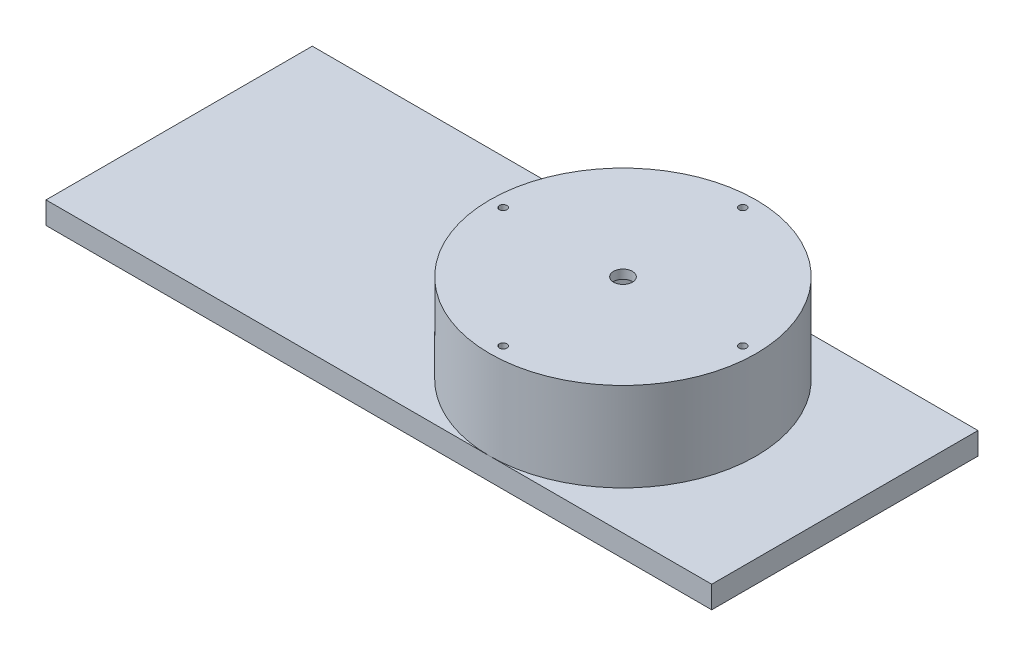
ISO-10303-21;
HEADER;
FILE_DESCRIPTION(('STEP AP214'),'2;1');
FILE_NAME('part.step','',(''),(''),'','','');
FILE_SCHEMA(('AUTOMOTIVE_DESIGN { 1 0 10303 214 1 1 1 1 }'));
ENDSEC;
DATA;
#1=APPLICATION_CONTEXT('core data for automotive mechanical design processes');
#2=APPLICATION_PROTOCOL_DEFINITION('international standard','automotive_design',2000,#1);
#3=PRODUCT_CONTEXT('',#1,'mechanical');
#4=PRODUCT('Part','Part','',(#3));
#5=PRODUCT_RELATED_PRODUCT_CATEGORY('part','',(#4));
#6=PRODUCT_DEFINITION_FORMATION('','',#4);
#7=PRODUCT_DEFINITION_CONTEXT('part definition',#1,'design');
#8=PRODUCT_DEFINITION('design','',#6,#7);
#9=PRODUCT_DEFINITION_SHAPE('','',#8);
#10=(LENGTH_UNIT() NAMED_UNIT(*) SI_UNIT(.MILLI.,.METRE.));
#11=(NAMED_UNIT(*) PLANE_ANGLE_UNIT() SI_UNIT($,.RADIAN.));
#12=(NAMED_UNIT(*) SI_UNIT($,.STERADIAN.) SOLID_ANGLE_UNIT());
#13=UNCERTAINTY_MEASURE_WITH_UNIT(LENGTH_MEASURE(1.E-05),#10,'distance_accuracy_value','');
#14=(GEOMETRIC_REPRESENTATION_CONTEXT(3) GLOBAL_UNCERTAINTY_ASSIGNED_CONTEXT((#13)) GLOBAL_UNIT_ASSIGNED_CONTEXT((#10,
#11,#12)) REPRESENTATION_CONTEXT('',''));
#15=CARTESIAN_POINT('',(0.,0.,0.));
#16=DIRECTION('',(0.,0.,1.));
#17=DIRECTION('',(1.,0.,0.));
#18=AXIS2_PLACEMENT_3D('',#15,#16,#17);
#19=CARTESIAN_POINT('',(-100.,50.,-60.));
#20=DIRECTION('',(0.,-1.,0.));
#21=DIRECTION('',(0.,0.,-1.));
#22=AXIS2_PLACEMENT_3D('',#19,#20,#21);
#23=CYLINDRICAL_SURFACE('',#22,60.);
#24=CARTESIAN_POINT('',(-100.,50.,-60.));
#25=DIRECTION('',(0.,1.,0.));
#26=DIRECTION('',(0.,0.,1.));
#27=AXIS2_PLACEMENT_3D('',#24,#25,#26);
#28=CIRCLE('',#27,60.);
#29=CARTESIAN_POINT('',(-100.,50.,0.));
#30=VERTEX_POINT('',#29);
#31=EDGE_CURVE('E176',#30,#30,#28,.T.);
#32=ORIENTED_EDGE('',*,*,#31,.F.);
#33=EDGE_LOOP('',(#32));
#34=FACE_BOUND('',#33,.T.);
#35=CARTESIAN_POINT('',(-100.,12.,-60.));
#36=DIRECTION('',(0.,-1.,0.));
#37=DIRECTION('',(0.,0.,-1.));
#38=AXIS2_PLACEMENT_3D('',#35,#36,#37);
#39=CIRCLE('',#38,60.);
#40=CARTESIAN_POINT('',(-159.160797830996,12.,-50.));
#41=VERTEX_POINT('',#40);
#42=CARTESIAN_POINT('',(-159.160797830996,12.,-70.));
#43=VERTEX_POINT('',#42);
#44=EDGE_CURVE('E159',#41,#43,#39,.T.);
#45=ORIENTED_EDGE('',*,*,#44,.F.);
#46=DIRECTION('',(0.,-1.,0.));
#47=VECTOR('',#46,1.);
#48=CARTESIAN_POINT('',(-159.160797830996,50.,-50.));
#49=LINE('',#48,#47);
#50=CARTESIAN_POINT('',(-159.160797830996,10.,-50.));
#51=VERTEX_POINT('',#50);
#52=EDGE_CURVE('E156',#41,#51,#49,.T.);
#53=ORIENTED_EDGE('',*,*,#52,.T.);
#54=CARTESIAN_POINT('',(-100.,10.,-60.));
#55=DIRECTION('',(0.,1.,0.));
#56=DIRECTION('',(0.,0.,1.));
#57=AXIS2_PLACEMENT_3D('',#54,#55,#56);
#58=CIRCLE('',#57,60.);
#59=CARTESIAN_POINT('',(-100.,10.,0.));
#60=VERTEX_POINT('',#59);
#61=EDGE_CURVE('E182',#51,#60,#58,.T.);
#62=ORIENTED_EDGE('',*,*,#61,.T.);
#63=CARTESIAN_POINT('',(-100.,10.,-120.));
#64=VERTEX_POINT('',#63);
#65=EDGE_CURVE('E173',#60,#64,#58,.T.);
#66=ORIENTED_EDGE('',*,*,#65,.T.);
#67=CARTESIAN_POINT('',(-159.160797830996,10.,-70.));
#68=VERTEX_POINT('',#67);
#69=EDGE_CURVE('E183',#64,#68,#58,.T.);
#70=ORIENTED_EDGE('',*,*,#69,.T.);
#71=DIRECTION('',(0.,-1.,0.));
#72=VECTOR('',#71,1.);
#73=CARTESIAN_POINT('',(-159.160797830996,50.,-70.));
#74=LINE('',#73,#72);
#75=EDGE_CURVE('E161',#43,#68,#74,.T.);
#76=ORIENTED_EDGE('',*,*,#75,.F.);
#77=EDGE_LOOP('',(#45,#53,#62,#66,#70,#76));
#78=FACE_BOUND('',#77,.T.);
#79=ADVANCED_FACE('F36',(#34,#78),#23,.T.);
#80=CARTESIAN_POINT('',(-100.,46.,-60.));
#81=DIRECTION('',(0.,-1.,0.));
#82=DIRECTION('',(0.,0.,-1.));
#83=AXIS2_PLACEMENT_3D('',#80,#81,#82);
#84=CYLINDRICAL_SURFACE('',#83,48.);
#85=CARTESIAN_POINT('',(-100.,0.,-60.));
#86=DIRECTION('',(0.,-1.,0.));
#87=DIRECTION('',(0.,0.,-1.));
#88=AXIS2_PLACEMENT_3D('',#85,#86,#87);
#89=CIRCLE('',#88,48.);
#90=CARTESIAN_POINT('',(-100.,0.,-108.));
#91=VERTEX_POINT('',#90);
#92=EDGE_CURVE('E169',#91,#91,#89,.T.);
#93=ORIENTED_EDGE('',*,*,#92,.T.);
#94=EDGE_LOOP('',(#93));
#95=FACE_BOUND('',#94,.T.);
#96=CARTESIAN_POINT('',(-100.,46.,-60.));
#97=DIRECTION('',(0.,-1.,0.));
#98=DIRECTION('',(0.,0.,-1.));
#99=AXIS2_PLACEMENT_3D('',#96,#97,#98);
#100=CIRCLE('',#99,48.);
#101=CARTESIAN_POINT('',(-100.,46.,-108.));
#102=VERTEX_POINT('',#101);
#103=EDGE_CURVE('E170',#102,#102,#100,.T.);
#104=ORIENTED_EDGE('',*,*,#103,.F.);
#105=EDGE_LOOP('',(#104));
#106=FACE_BOUND('',#105,.T.);
#107=DIRECTION('',(0.,-1.,0.));
#108=VECTOR('',#107,1.);
#109=CARTESIAN_POINT('',(-146.946778377222,46.,-70.));
#110=LINE('',#109,#108);
#111=CARTESIAN_POINT('',(-146.946778377222,10.,-70.));
#112=VERTEX_POINT('',#111);
#113=CARTESIAN_POINT('',(-146.946778377222,12.,-70.));
#114=VERTEX_POINT('',#113);
#115=EDGE_CURVE('E11',#112,#114,#110,.F.);
#116=ORIENTED_EDGE('',*,*,#115,.F.);
#117=CARTESIAN_POINT('',(-100.,10.,-60.));
#118=DIRECTION('',(0.,-1.,0.));
#119=DIRECTION('',(0.,0.,-1.));
#120=AXIS2_PLACEMENT_3D('',#117,#118,#119);
#121=CIRCLE('',#120,48.);
#122=CARTESIAN_POINT('',(-146.946778377222,10.,-50.));
#123=VERTEX_POINT('',#122);
#124=EDGE_CURVE('E217',#112,#123,#121,.F.);
#125=ORIENTED_EDGE('',*,*,#124,.T.);
#126=DIRECTION('',(0.,-1.,0.));
#127=VECTOR('',#126,1.);
#128=CARTESIAN_POINT('',(-146.946778377222,46.,-50.));
#129=LINE('',#128,#127);
#130=CARTESIAN_POINT('',(-146.946778377222,12.,-50.));
#131=VERTEX_POINT('',#130);
#132=EDGE_CURVE('E220',#123,#131,#129,.F.);
#133=ORIENTED_EDGE('',*,*,#132,.T.);
#134=CARTESIAN_POINT('',(-100.,12.,-60.));
#135=DIRECTION('',(0.,-1.,0.));
#136=DIRECTION('',(0.,0.,-1.));
#137=AXIS2_PLACEMENT_3D('',#134,#135,#136);
#138=CIRCLE('',#137,48.);
#139=EDGE_CURVE('E44',#114,#131,#138,.F.);
#140=ORIENTED_EDGE('',*,*,#139,.F.);
#141=EDGE_LOOP('',(#116,#125,#133,#140));
#142=FACE_BOUND('',#141,.T.);
#143=ADVANCED_FACE('F232',(#95,#106,#142),#84,.F.);
#144=CARTESIAN_POINT('',(0.,10.,0.));
#145=DIRECTION('',(0.,1.,0.));
#146=DIRECTION('',(0.,0.,1.));
#147=AXIS2_PLACEMENT_3D('',#144,#145,#146);
#148=PLANE('',#147);
#149=ORIENTED_EDGE('',*,*,#65,.F.);
#150=DIRECTION('',(1.,0.,0.));
#151=VECTOR('',#150,1.);
#152=CARTESIAN_POINT('',(0.,10.,0.));
#153=LINE('',#152,#151);
#154=CARTESIAN_POINT('',(0.,10.,0.));
#155=VERTEX_POINT('',#154);
#156=EDGE_CURVE('E194',#60,#155,#153,.T.);
#157=ORIENTED_EDGE('',*,*,#156,.T.);
#158=DIRECTION('',(0.,0.,-1.));
#159=VECTOR('',#158,1.);
#160=CARTESIAN_POINT('',(0.,10.,0.));
#161=LINE('',#160,#159);
#162=CARTESIAN_POINT('',(0.,10.,-120.));
#163=VERTEX_POINT('',#162);
#164=EDGE_CURVE('E184',#155,#163,#161,.T.);
#165=ORIENTED_EDGE('',*,*,#164,.T.);
#166=DIRECTION('',(-1.,0.,0.));
#167=VECTOR('',#166,1.);
#168=CARTESIAN_POINT('',(0.,10.,-120.));
#169=LINE('',#168,#167);
#170=EDGE_CURVE('E189',#163,#64,#169,.T.);
#171=ORIENTED_EDGE('',*,*,#170,.T.);
#172=EDGE_LOOP('',(#149,#157,#165,#171));
#173=FACE_BOUND('',#172,.T.);
#174=ADVANCED_FACE('F250',(#173),#148,.T.);
#175=CARTESIAN_POINT('',(0.,10.,0.));
#176=DIRECTION('',(-1.,0.,0.));
#177=DIRECTION('',(0.,0.,1.));
#178=AXIS2_PLACEMENT_3D('',#175,#176,#177);
#179=PLANE('',#178);
#180=DIRECTION('',(0.,0.,-1.));
#181=VECTOR('',#180,1.);
#182=CARTESIAN_POINT('',(0.,0.,0.));
#183=LINE('',#182,#181);
#184=CARTESIAN_POINT('',(0.,0.,0.));
#185=VERTEX_POINT('',#184);
#186=CARTESIAN_POINT('',(0.,0.,-120.));
#187=VERTEX_POINT('',#186);
#188=EDGE_CURVE('E179',#185,#187,#183,.T.);
#189=ORIENTED_EDGE('',*,*,#188,.T.);
#190=DIRECTION('',(0.,-1.,0.));
#191=VECTOR('',#190,1.);
#192=CARTESIAN_POINT('',(0.,10.,-120.));
#193=LINE('',#192,#191);
#194=EDGE_CURVE('E214',#163,#187,#193,.T.);
#195=ORIENTED_EDGE('',*,*,#194,.F.);
#196=ORIENTED_EDGE('',*,*,#164,.F.);
#197=DIRECTION('',(0.,-1.,0.));
#198=VECTOR('',#197,1.);
#199=CARTESIAN_POINT('',(0.,10.,0.));
#200=LINE('',#199,#198);
#201=EDGE_CURVE('E198',#155,#185,#200,.T.);
#202=ORIENTED_EDGE('',*,*,#201,.T.);
#203=EDGE_LOOP('',(#189,#195,#196,#202));
#204=FACE_BOUND('',#203,.T.);
#205=ADVANCED_FACE('F38',(#204),#179,.F.);
#206=CARTESIAN_POINT('',(0.,10.,-120.));
#207=DIRECTION('',(0.,0.,1.));
#208=DIRECTION('',(1.,0.,0.));
#209=AXIS2_PLACEMENT_3D('',#206,#207,#208);
#210=PLANE('',#209);
#211=DIRECTION('',(-1.,0.,0.));
#212=VECTOR('',#211,1.);
#213=CARTESIAN_POINT('',(0.,0.,-120.));
#214=LINE('',#213,#212);
#215=CARTESIAN_POINT('',(-300.,0.,-120.));
#216=VERTEX_POINT('',#215);
#217=EDGE_CURVE('E201',#187,#216,#214,.T.);
#218=ORIENTED_EDGE('',*,*,#217,.T.);
#219=DIRECTION('',(0.,-1.,0.));
#220=VECTOR('',#219,1.);
#221=CARTESIAN_POINT('',(-300.,10.,-120.));
#222=LINE('',#221,#220);
#223=CARTESIAN_POINT('',(-300.,10.,-120.));
#224=VERTEX_POINT('',#223);
#225=EDGE_CURVE('E211',#224,#216,#222,.T.);
#226=ORIENTED_EDGE('',*,*,#225,.F.);
#227=EDGE_CURVE('E187',#64,#224,#169,.T.);
#228=ORIENTED_EDGE('',*,*,#227,.F.);
#229=ORIENTED_EDGE('',*,*,#170,.F.);
#230=ORIENTED_EDGE('',*,*,#194,.T.);
#231=EDGE_LOOP('',(#218,#226,#228,#229,#230));
#232=FACE_BOUND('',#231,.T.);
#233=ADVANCED_FACE('F253',(#232),#210,.F.);
#234=CARTESIAN_POINT('',(-300.,10.,0.));
#235=DIRECTION('',(1.,0.,0.));
#236=DIRECTION('',(0.,0.,-1.));
#237=AXIS2_PLACEMENT_3D('',#234,#235,#236);
#238=PLANE('',#237);
#239=DIRECTION('',(0.,0.,1.));
#240=VECTOR('',#239,1.);
#241=CARTESIAN_POINT('',(-300.,0.,0.));
#242=LINE('',#241,#240);
#243=CARTESIAN_POINT('',(-300.,0.,0.));
#244=VERTEX_POINT('',#243);
#245=EDGE_CURVE('E203',#216,#244,#242,.T.);
#246=ORIENTED_EDGE('',*,*,#245,.T.);
#247=DIRECTION('',(0.,-1.,0.));
#248=VECTOR('',#247,1.);
#249=CARTESIAN_POINT('',(-300.,10.,0.));
#250=LINE('',#249,#248);
#251=CARTESIAN_POINT('',(-300.,10.,0.));
#252=VERTEX_POINT('',#251);
#253=EDGE_CURVE('E208',#252,#244,#250,.T.);
#254=ORIENTED_EDGE('',*,*,#253,.F.);
#255=DIRECTION('',(0.,0.,1.));
#256=VECTOR('',#255,1.);
#257=CARTESIAN_POINT('',(-300.,10.,0.));
#258=LINE('',#257,#256);
#259=EDGE_CURVE('E192',#224,#252,#258,.T.);
#260=ORIENTED_EDGE('',*,*,#259,.F.);
#261=ORIENTED_EDGE('',*,*,#225,.T.);
#262=EDGE_LOOP('',(#246,#254,#260,#261));
#263=FACE_BOUND('',#262,.T.);
#264=ADVANCED_FACE('F257',(#263),#238,.F.);
#265=CARTESIAN_POINT('',(0.,10.,0.));
#266=DIRECTION('',(0.,0.,-1.));
#267=DIRECTION('',(-1.,0.,0.));
#268=AXIS2_PLACEMENT_3D('',#265,#266,#267);
#269=PLANE('',#268);
#270=DIRECTION('',(1.,0.,0.));
#271=VECTOR('',#270,1.);
#272=CARTESIAN_POINT('',(0.,0.,0.));
#273=LINE('',#272,#271);
#274=EDGE_CURVE('E188',#244,#185,#273,.T.);
#275=ORIENTED_EDGE('',*,*,#274,.T.);
#276=ORIENTED_EDGE('',*,*,#201,.F.);
#277=ORIENTED_EDGE('',*,*,#156,.F.);
#278=EDGE_CURVE('E195',#252,#60,#153,.T.);
#279=ORIENTED_EDGE('',*,*,#278,.F.);
#280=ORIENTED_EDGE('',*,*,#253,.T.);
#281=EDGE_LOOP('',(#275,#276,#277,#279,#280));
#282=FACE_BOUND('',#281,.T.);
#283=ADVANCED_FACE('F247',(#282),#269,.F.);
#284=DIRECTION('',(-1.,0.,0.));
#285=VECTOR('',#284,1.);
#286=CARTESIAN_POINT('',(-114.,10.,-70.));
#287=LINE('',#286,#285);
#288=EDGE_CURVE('E51',#112,#68,#287,.T.);
#289=ORIENTED_EDGE('',*,*,#288,.T.);
#290=ORIENTED_EDGE('',*,*,#69,.F.);
#291=ORIENTED_EDGE('',*,*,#227,.T.);
#292=ORIENTED_EDGE('',*,*,#259,.T.);
#293=ORIENTED_EDGE('',*,*,#278,.T.);
#294=ORIENTED_EDGE('',*,*,#61,.F.);
#295=DIRECTION('',(-1.,0.,0.));
#296=VECTOR('',#295,1.);
#297=CARTESIAN_POINT('',(-114.,10.,-50.));
#298=LINE('',#297,#296);
#299=EDGE_CURVE('E57',#123,#51,#298,.T.);
#300=ORIENTED_EDGE('',*,*,#299,.F.);
#301=ORIENTED_EDGE('',*,*,#124,.F.);
#302=EDGE_LOOP('',(#289,#290,#291,#292,#293,#294,#300,#301));
#303=FACE_BOUND('',#302,.T.);
#304=ADVANCED_FACE('F233',(#303),#148,.T.);
#305=CARTESIAN_POINT('',(0.,0.,0.));
#306=DIRECTION('',(0.,1.,0.));
#307=DIRECTION('',(0.,0.,1.));
#308=AXIS2_PLACEMENT_3D('',#305,#306,#307);
#309=PLANE('',#308);
#310=ORIENTED_EDGE('',*,*,#92,.F.);
#311=EDGE_LOOP('',(#310));
#312=FACE_BOUND('',#311,.T.);
#313=ORIENTED_EDGE('',*,*,#188,.F.);
#314=ORIENTED_EDGE('',*,*,#274,.F.);
#315=ORIENTED_EDGE('',*,*,#245,.F.);
#316=ORIENTED_EDGE('',*,*,#217,.F.);
#317=EDGE_LOOP('',(#313,#314,#315,#316));
#318=FACE_BOUND('',#317,.T.);
#319=ADVANCED_FACE('F261',(#312,#318),#309,.F.);
#320=CARTESIAN_POINT('',(-100.,50.,-60.));
#321=DIRECTION('',(0.,1.,0.));
#322=DIRECTION('',(0.,0.,1.));
#323=AXIS2_PLACEMENT_3D('',#320,#321,#322);
#324=PLANE('',#323);
#325=CARTESIAN_POINT('',(-100.,50.,-114.));
#326=DIRECTION('',(0.,1.,0.));
#327=DIRECTION('',(0.,0.,1.));
#328=AXIS2_PLACEMENT_3D('',#325,#326,#327);
#329=CIRCLE('',#328,1.69999999999999);
#330=CARTESIAN_POINT('',(-100.,50.,-112.3));
#331=VERTEX_POINT('',#330);
#332=EDGE_CURVE('E126',#331,#331,#329,.T.);
#333=ORIENTED_EDGE('',*,*,#332,.F.);
#334=EDGE_LOOP('',(#333));
#335=FACE_BOUND('',#334,.T.);
#336=CARTESIAN_POINT('',(-46.,50.,-60.));
#337=DIRECTION('',(0.,1.,0.));
#338=DIRECTION('',(0.,0.,1.));
#339=AXIS2_PLACEMENT_3D('',#336,#337,#338);
#340=CIRCLE('',#339,1.69999999999999);
#341=CARTESIAN_POINT('',(-46.,50.,-58.3));
#342=VERTEX_POINT('',#341);
#343=EDGE_CURVE('E125',#342,#342,#340,.T.);
#344=ORIENTED_EDGE('',*,*,#343,.F.);
#345=EDGE_LOOP('',(#344));
#346=FACE_BOUND('',#345,.T.);
#347=CARTESIAN_POINT('',(-100.,50.,-5.99999999999998));
#348=DIRECTION('',(0.,1.,0.));
#349=DIRECTION('',(0.,0.,1.));
#350=AXIS2_PLACEMENT_3D('',#347,#348,#349);
#351=CIRCLE('',#350,1.69999999999999);
#352=CARTESIAN_POINT('',(-100.,50.,-4.29999999999998));
#353=VERTEX_POINT('',#352);
#354=EDGE_CURVE('E136',#353,#353,#351,.T.);
#355=ORIENTED_EDGE('',*,*,#354,.F.);
#356=EDGE_LOOP('',(#355));
#357=FACE_BOUND('',#356,.T.);
#358=CARTESIAN_POINT('',(-154.,50.,-60.));
#359=DIRECTION('',(0.,1.,0.));
#360=DIRECTION('',(0.,0.,1.));
#361=AXIS2_PLACEMENT_3D('',#358,#359,#360);
#362=CIRCLE('',#361,1.69999999999998);
#363=CARTESIAN_POINT('',(-154.,50.,-58.3));
#364=VERTEX_POINT('',#363);
#365=EDGE_CURVE('E142',#364,#364,#362,.T.);
#366=ORIENTED_EDGE('',*,*,#365,.F.);
#367=EDGE_LOOP('',(#366));
#368=FACE_BOUND('',#367,.T.);
#369=CARTESIAN_POINT('',(-100.,50.,-60.));
#370=DIRECTION('',(0.,1.,0.));
#371=DIRECTION('',(0.,0.,1.));
#372=AXIS2_PLACEMENT_3D('',#369,#370,#371);
#373=CIRCLE('',#372,4.25000000000001);
#374=CARTESIAN_POINT('',(-100.,50.,-55.75));
#375=VERTEX_POINT('',#374);
#376=EDGE_CURVE('E166',#375,#375,#373,.T.);
#377=ORIENTED_EDGE('',*,*,#376,.F.);
#378=EDGE_LOOP('',(#377));
#379=FACE_BOUND('',#378,.T.);
#380=ORIENTED_EDGE('',*,*,#31,.T.);
#381=EDGE_LOOP('',(#380));
#382=FACE_BOUND('',#381,.T.);
#383=ADVANCED_FACE('F279',(#335,#346,#357,#368,#379,#382),#324,.T.);
#384=CARTESIAN_POINT('',(-100.,46.,-60.));
#385=DIRECTION('',(0.,-1.,0.));
#386=DIRECTION('',(0.,0.,-1.));
#387=AXIS2_PLACEMENT_3D('',#384,#385,#386);
#388=PLANE('',#387);
#389=CARTESIAN_POINT('',(-100.,46.,-60.));
#390=DIRECTION('',(0.,-1.,0.));
#391=DIRECTION('',(0.,0.,-1.));
#392=AXIS2_PLACEMENT_3D('',#389,#390,#391);
#393=CIRCLE('',#392,4.25000000000001);
#394=CARTESIAN_POINT('',(-100.,46.,-64.25));
#395=VERTEX_POINT('',#394);
#396=EDGE_CURVE('E163',#395,#395,#393,.T.);
#397=ORIENTED_EDGE('',*,*,#396,.F.);
#398=EDGE_LOOP('',(#397));
#399=FACE_BOUND('',#398,.T.);
#400=ORIENTED_EDGE('',*,*,#103,.T.);
#401=EDGE_LOOP('',(#400));
#402=FACE_BOUND('',#401,.T.);
#403=ADVANCED_FACE('F314',(#399,#402),#388,.T.);
#404=CARTESIAN_POINT('',(-100.,92.,-60.));
#405=DIRECTION('',(0.,-1.,0.));
#406=DIRECTION('',(0.,0.,-1.));
#407=AXIS2_PLACEMENT_3D('',#404,#405,#406);
#408=CYLINDRICAL_SURFACE('',#407,4.25000000000001);
#409=ORIENTED_EDGE('',*,*,#376,.T.);
#410=EDGE_LOOP('',(#409));
#411=FACE_BOUND('',#410,.T.);
#412=ORIENTED_EDGE('',*,*,#396,.T.);
#413=EDGE_LOOP('',(#412));
#414=FACE_BOUND('',#413,.T.);
#415=ADVANCED_FACE('F322',(#411,#414),#408,.F.);
#416=CARTESIAN_POINT('',(-114.,10.,-70.));
#417=DIRECTION('',(0.,0.,1.));
#418=DIRECTION('',(1.,0.,0.));
#419=AXIS2_PLACEMENT_3D('',#416,#417,#418);
#420=PLANE('',#419);
#421=ORIENTED_EDGE('',*,*,#75,.T.);
#422=ORIENTED_EDGE('',*,*,#288,.F.);
#423=ORIENTED_EDGE('',*,*,#115,.T.);
#424=DIRECTION('',(-1.,0.,0.));
#425=VECTOR('',#424,1.);
#426=CARTESIAN_POINT('',(-114.,12.,-70.));
#427=LINE('',#426,#425);
#428=EDGE_CURVE('E153',#114,#43,#427,.T.);
#429=ORIENTED_EDGE('',*,*,#428,.T.);
#430=EDGE_LOOP('',(#421,#422,#423,#429));
#431=FACE_BOUND('',#430,.T.);
#432=ADVANCED_FACE('F235',(#431),#420,.T.);
#433=CARTESIAN_POINT('',(-114.,12.,-70.));
#434=DIRECTION('',(0.,-1.,0.));
#435=DIRECTION('',(0.,0.,-1.));
#436=AXIS2_PLACEMENT_3D('',#433,#434,#435);
#437=PLANE('',#436);
#438=ORIENTED_EDGE('',*,*,#44,.T.);
#439=ORIENTED_EDGE('',*,*,#428,.F.);
#440=ORIENTED_EDGE('',*,*,#139,.T.);
#441=DIRECTION('',(-1.,0.,0.));
#442=VECTOR('',#441,1.);
#443=CARTESIAN_POINT('',(-114.,12.,-50.));
#444=LINE('',#443,#442);
#445=EDGE_CURVE('E150',#131,#41,#444,.T.);
#446=ORIENTED_EDGE('',*,*,#445,.T.);
#447=EDGE_LOOP('',(#438,#439,#440,#446));
#448=FACE_BOUND('',#447,.T.);
#449=ADVANCED_FACE('F226',(#448),#437,.T.);
#450=CARTESIAN_POINT('',(-114.,10.,-50.));
#451=DIRECTION('',(0.,0.,1.));
#452=DIRECTION('',(1.,0.,0.));
#453=AXIS2_PLACEMENT_3D('',#450,#451,#452);
#454=PLANE('',#453);
#455=ORIENTED_EDGE('',*,*,#445,.F.);
#456=ORIENTED_EDGE('',*,*,#132,.F.);
#457=ORIENTED_EDGE('',*,*,#299,.T.);
#458=ORIENTED_EDGE('',*,*,#52,.F.);
#459=EDGE_LOOP('',(#455,#456,#457,#458));
#460=FACE_BOUND('',#459,.T.);
#461=ADVANCED_FACE('F231',(#460),#454,.F.);
#462=CARTESIAN_POINT('',(-154.,45.,-60.));
#463=DIRECTION('',(0.,1.,0.));
#464=DIRECTION('',(0.,0.,1.));
#465=AXIS2_PLACEMENT_3D('',#462,#463,#464);
#466=CONICAL_SURFACE('',#465,1.69999999999998,1.02974425867665);
#467=CARTESIAN_POINT('',(-154.,43.9785369476531,-60.));
#468=VERTEX_POINT('',#467);
#469=VERTEX_LOOP('',#468);
#470=FACE_BOUND('',#469,.T.);
#471=CARTESIAN_POINT('',(-154.,45.,-60.));
#472=DIRECTION('',(0.,1.,0.));
#473=DIRECTION('',(0.,0.,1.));
#474=AXIS2_PLACEMENT_3D('',#471,#472,#473);
#475=CIRCLE('',#474,1.69999999999998);
#476=CARTESIAN_POINT('',(-154.,45.,-58.3));
#477=VERTEX_POINT('',#476);
#478=EDGE_CURVE('E145',#477,#477,#475,.T.);
#479=ORIENTED_EDGE('',*,*,#478,.T.);
#480=EDGE_LOOP('',(#479));
#481=FACE_BOUND('',#480,.T.);
#482=ADVANCED_FACE('F347',(#470,#481),#466,.F.);
#483=CARTESIAN_POINT('',(-154.,50.,-60.));
#484=DIRECTION('',(0.,1.,0.));
#485=DIRECTION('',(0.,0.,1.));
#486=AXIS2_PLACEMENT_3D('',#483,#484,#485);
#487=CYLINDRICAL_SURFACE('',#486,1.69999999999998);
#488=ORIENTED_EDGE('',*,*,#478,.F.);
#489=EDGE_LOOP('',(#488));
#490=FACE_BOUND('',#489,.T.);
#491=ORIENTED_EDGE('',*,*,#365,.T.);
#492=EDGE_LOOP('',(#491));
#493=FACE_BOUND('',#492,.T.);
#494=ADVANCED_FACE('F353',(#490,#493),#487,.F.);
#495=CARTESIAN_POINT('',(-100.,45.,-5.99999999999998));
#496=DIRECTION('',(0.,1.,0.));
#497=DIRECTION('',(0.,0.,1.));
#498=AXIS2_PLACEMENT_3D('',#495,#496,#497);
#499=CONICAL_SURFACE('',#498,1.69999999999998,1.02974425867665);
#500=CARTESIAN_POINT('',(-100.,43.9785369476531,-5.99999999999998));
#501=VERTEX_POINT('',#500);
#502=VERTEX_LOOP('',#501);
#503=FACE_BOUND('',#502,.T.);
#504=CARTESIAN_POINT('',(-100.,45.,-5.99999999999998));
#505=DIRECTION('',(0.,1.,0.));
#506=DIRECTION('',(0.,0.,1.));
#507=AXIS2_PLACEMENT_3D('',#504,#505,#506);
#508=CIRCLE('',#507,1.69999999999998);
#509=CARTESIAN_POINT('',(-100.,45.,-4.3));
#510=VERTEX_POINT('',#509);
#511=EDGE_CURVE('E139',#510,#510,#508,.T.);
#512=ORIENTED_EDGE('',*,*,#511,.T.);
#513=EDGE_LOOP('',(#512));
#514=FACE_BOUND('',#513,.T.);
#515=ADVANCED_FACE('F361',(#503,#514),#499,.F.);
#516=CARTESIAN_POINT('',(-100.,50.,-5.99999999999998));
#517=DIRECTION('',(0.,1.,0.));
#518=DIRECTION('',(0.,0.,1.));
#519=AXIS2_PLACEMENT_3D('',#516,#517,#518);
#520=CYLINDRICAL_SURFACE('',#519,1.69999999999999);
#521=ORIENTED_EDGE('',*,*,#511,.F.);
#522=EDGE_LOOP('',(#521));
#523=FACE_BOUND('',#522,.T.);
#524=ORIENTED_EDGE('',*,*,#354,.T.);
#525=EDGE_LOOP('',(#524));
#526=FACE_BOUND('',#525,.T.);
#527=ADVANCED_FACE('F369',(#523,#526),#520,.F.);
#528=CARTESIAN_POINT('',(-46.,45.,-60.));
#529=DIRECTION('',(0.,1.,0.));
#530=DIRECTION('',(0.,0.,1.));
#531=AXIS2_PLACEMENT_3D('',#528,#529,#530);
#532=CONICAL_SURFACE('',#531,1.69999999999998,1.02974425867665);
#533=CARTESIAN_POINT('',(-46.,43.9785369476531,-60.));
#534=VERTEX_POINT('',#533);
#535=VERTEX_LOOP('',#534);
#536=FACE_BOUND('',#535,.T.);
#537=CARTESIAN_POINT('',(-46.,45.,-60.));
#538=DIRECTION('',(0.,1.,0.));
#539=DIRECTION('',(0.,0.,1.));
#540=AXIS2_PLACEMENT_3D('',#537,#538,#539);
#541=CIRCLE('',#540,1.69999999999998);
#542=CARTESIAN_POINT('',(-46.,45.,-58.3));
#543=VERTEX_POINT('',#542);
#544=EDGE_CURVE('E129',#543,#543,#541,.T.);
#545=ORIENTED_EDGE('',*,*,#544,.T.);
#546=EDGE_LOOP('',(#545));
#547=FACE_BOUND('',#546,.T.);
#548=ADVANCED_FACE('F377',(#536,#547),#532,.F.);
#549=CARTESIAN_POINT('',(-46.,50.,-60.));
#550=DIRECTION('',(0.,1.,0.));
#551=DIRECTION('',(0.,0.,1.));
#552=AXIS2_PLACEMENT_3D('',#549,#550,#551);
#553=CYLINDRICAL_SURFACE('',#552,1.69999999999998);
#554=ORIENTED_EDGE('',*,*,#544,.F.);
#555=EDGE_LOOP('',(#554));
#556=FACE_BOUND('',#555,.T.);
#557=ORIENTED_EDGE('',*,*,#343,.T.);
#558=EDGE_LOOP('',(#557));
#559=FACE_BOUND('',#558,.T.);
#560=ADVANCED_FACE('F119',(#556,#559),#553,.F.);
#561=CARTESIAN_POINT('',(-100.,45.,-114.));
#562=DIRECTION('',(0.,1.,0.));
#563=DIRECTION('',(0.,0.,1.));
#564=AXIS2_PLACEMENT_3D('',#561,#562,#563);
#565=CONICAL_SURFACE('',#564,1.69999999999998,1.02974425867665);
#566=CARTESIAN_POINT('',(-100.,43.9785369476531,-114.));
#567=VERTEX_POINT('',#566);
#568=VERTEX_LOOP('',#567);
#569=FACE_BOUND('',#568,.T.);
#570=CARTESIAN_POINT('',(-100.,45.,-114.));
#571=DIRECTION('',(0.,1.,0.));
#572=DIRECTION('',(0.,0.,1.));
#573=AXIS2_PLACEMENT_3D('',#570,#571,#572);
#574=CIRCLE('',#573,1.69999999999998);
#575=CARTESIAN_POINT('',(-100.,45.,-112.3));
#576=VERTEX_POINT('',#575);
#577=EDGE_CURVE('E123',#576,#576,#574,.T.);
#578=ORIENTED_EDGE('',*,*,#577,.T.);
#579=EDGE_LOOP('',(#578));
#580=FACE_BOUND('',#579,.T.);
#581=ADVANCED_FACE('F115',(#569,#580),#565,.F.);
#582=CARTESIAN_POINT('',(-100.,50.,-114.));
#583=DIRECTION('',(0.,1.,0.));
#584=DIRECTION('',(0.,0.,1.));
#585=AXIS2_PLACEMENT_3D('',#582,#583,#584);
#586=CYLINDRICAL_SURFACE('',#585,1.69999999999999);
#587=ORIENTED_EDGE('',*,*,#577,.F.);
#588=EDGE_LOOP('',(#587));
#589=FACE_BOUND('',#588,.T.);
#590=ORIENTED_EDGE('',*,*,#332,.T.);
#591=EDGE_LOOP('',(#590));
#592=FACE_BOUND('',#591,.T.);
#593=ADVANCED_FACE('F118',(#589,#592),#586,.F.);
#594=CLOSED_SHELL('',(#79,#143,#174,#205,#233,#264,#283,#304,#319,#383,#403,#415,#432,#449,#461,
#482,#494,#515,#527,#548,#560,#581,#593));
#595=MANIFOLD_SOLID_BREP('B2',#594);
#596=ADVANCED_BREP_SHAPE_REPRESENTATION('',(#18,#595),#14);
#597=SHAPE_DEFINITION_REPRESENTATION(#9,#596);
ENDSEC;
END-ISO-10303-21;
